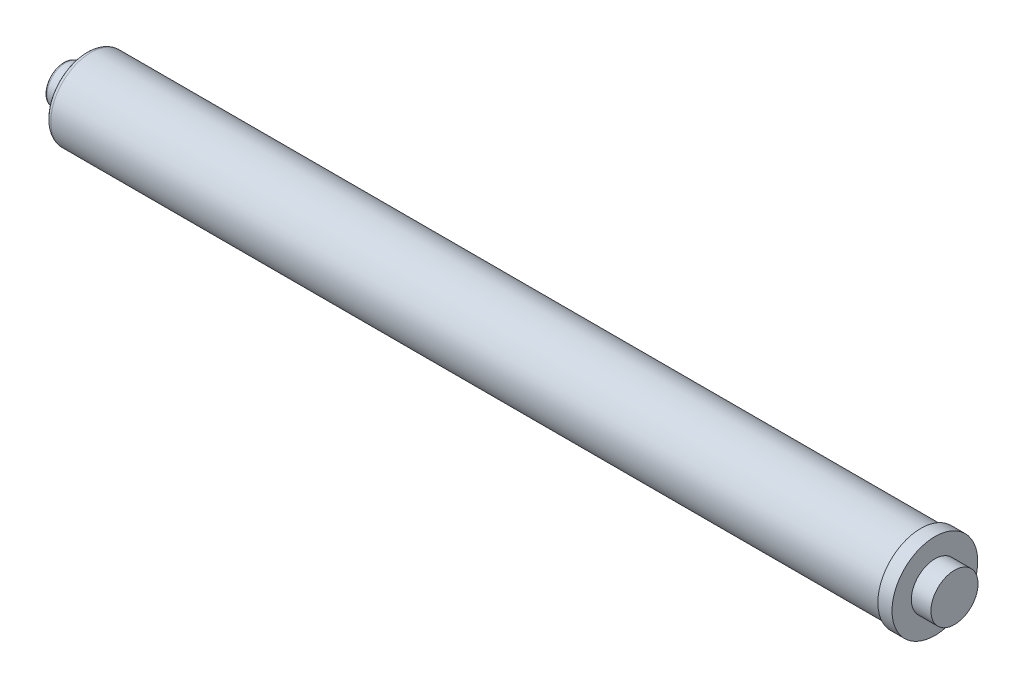
ISO-10303-21;
HEADER;
FILE_DESCRIPTION(('STEP AP214'),'2;1');
FILE_NAME('part.step','',(''),(''),'','','');
FILE_SCHEMA(('AUTOMOTIVE_DESIGN { 1 0 10303 214 1 1 1 1 }'));
ENDSEC;
DATA;
#1=APPLICATION_CONTEXT('core data for automotive mechanical design processes');
#2=APPLICATION_PROTOCOL_DEFINITION('international standard','automotive_design',2000,#1);
#3=PRODUCT_CONTEXT('',#1,'mechanical');
#4=PRODUCT('Part','Part','',(#3));
#5=PRODUCT_RELATED_PRODUCT_CATEGORY('part','',(#4));
#6=PRODUCT_DEFINITION_FORMATION('','',#4);
#7=PRODUCT_DEFINITION_CONTEXT('part definition',#1,'design');
#8=PRODUCT_DEFINITION('design','',#6,#7);
#9=PRODUCT_DEFINITION_SHAPE('','',#8);
#10=(LENGTH_UNIT() NAMED_UNIT(*) SI_UNIT(.MILLI.,.METRE.));
#11=(NAMED_UNIT(*) PLANE_ANGLE_UNIT() SI_UNIT($,.RADIAN.));
#12=(NAMED_UNIT(*) SI_UNIT($,.STERADIAN.) SOLID_ANGLE_UNIT());
#13=UNCERTAINTY_MEASURE_WITH_UNIT(LENGTH_MEASURE(1.E-05),#10,'distance_accuracy_value','');
#14=(GEOMETRIC_REPRESENTATION_CONTEXT(3) GLOBAL_UNCERTAINTY_ASSIGNED_CONTEXT((#13)) GLOBAL_UNIT_ASSIGNED_CONTEXT((#10,
#11,#12)) REPRESENTATION_CONTEXT('',''));
#15=CARTESIAN_POINT('',(0.,0.,0.));
#16=DIRECTION('',(0.,0.,1.));
#17=DIRECTION('',(1.,0.,0.));
#18=AXIS2_PLACEMENT_3D('',#15,#16,#17);
#19=CARTESIAN_POINT('',(-319.562207995829,0.,0.));
#20=DIRECTION('',(-1.,0.,0.));
#21=DIRECTION('',(0.,0.,1.));
#22=AXIS2_PLACEMENT_3D('',#19,#20,#21);
#23=CYLINDRICAL_SURFACE('',#22,26.9875);
#24=CARTESIAN_POINT('',(-278.003,0.,0.));
#25=DIRECTION('',(-1.,0.,0.));
#26=DIRECTION('',(0.,0.,1.));
#27=AXIS2_PLACEMENT_3D('',#24,#25,#26);
#28=CIRCLE('',#27,26.9875);
#29=CARTESIAN_POINT('',(-278.003,0.,26.9875));
#30=VERTEX_POINT('',#29);
#31=EDGE_CURVE('E10',#30,#30,#28,.T.);
#32=ORIENTED_EDGE('',*,*,#31,.F.);
#33=EDGE_LOOP('',(#32));
#34=FACE_BOUND('',#33,.T.);
#35=CARTESIAN_POINT('',(281.178,0.,0.));
#36=DIRECTION('',(-1.,0.,0.));
#37=DIRECTION('',(0.,0.,1.));
#38=AXIS2_PLACEMENT_3D('',#35,#36,#37);
#39=CIRCLE('',#38,26.9875);
#40=CARTESIAN_POINT('',(281.178,0.,26.9875));
#41=VERTEX_POINT('',#40);
#42=EDGE_CURVE('E69',#41,#41,#39,.T.);
#43=ORIENTED_EDGE('',*,*,#42,.T.);
#44=EDGE_LOOP('',(#43));
#45=FACE_BOUND('',#44,.T.);
#46=ADVANCED_FACE('F35',(#34,#45),#23,.T.);
#47=CARTESIAN_POINT('',(-278.003,0.,0.));
#48=DIRECTION('',(-1.,0.,0.));
#49=DIRECTION('',(0.,0.,1.));
#50=AXIS2_PLACEMENT_3D('',#47,#48,#49);
#51=TOROIDAL_SURFACE('',#50,23.8125,3.17499999999999);
#52=CARTESIAN_POINT('',(-281.178,0.,0.));
#53=DIRECTION('',(-1.,0.,0.));
#54=DIRECTION('',(0.,0.,1.));
#55=AXIS2_PLACEMENT_3D('',#52,#53,#54);
#56=CIRCLE('',#55,23.8124999999999);
#57=CARTESIAN_POINT('',(-281.178,0.,23.8124999999999));
#58=VERTEX_POINT('',#57);
#59=EDGE_CURVE('E41',#58,#58,#56,.T.);
#60=ORIENTED_EDGE('',*,*,#59,.F.);
#61=EDGE_LOOP('',(#60));
#62=FACE_BOUND('',#61,.T.);
#63=ORIENTED_EDGE('',*,*,#31,.T.);
#64=EDGE_LOOP('',(#63));
#65=FACE_BOUND('',#64,.T.);
#66=ADVANCED_FACE('F86',(#62,#65),#51,.T.);
#67=CARTESIAN_POINT('',(-281.178,0.,0.));
#68=DIRECTION('',(-1.,0.,0.));
#69=DIRECTION('',(0.,0.,1.));
#70=AXIS2_PLACEMENT_3D('',#67,#68,#69);
#71=PLANE('',#70);
#72=ORIENTED_EDGE('',*,*,#59,.T.);
#73=EDGE_LOOP('',(#72));
#74=FACE_BOUND('',#73,.T.);
#75=CARTESIAN_POINT('',(-281.178,0.,0.));
#76=DIRECTION('',(-1.,0.,0.));
#77=DIRECTION('',(0.,0.,1.));
#78=AXIS2_PLACEMENT_3D('',#75,#76,#77);
#79=CIRCLE('',#78,12.7);
#80=CARTESIAN_POINT('',(-281.178,0.,12.7));
#81=VERTEX_POINT('',#80);
#82=EDGE_CURVE('E45',#81,#81,#79,.T.);
#83=ORIENTED_EDGE('',*,*,#82,.F.);
#84=EDGE_LOOP('',(#83));
#85=FACE_BOUND('',#84,.T.);
#86=ADVANCED_FACE('F91',(#74,#85),#71,.T.);
#87=CARTESIAN_POINT('',(-319.562207995829,0.,0.));
#88=DIRECTION('',(-1.,0.,0.));
#89=DIRECTION('',(0.,0.,1.));
#90=AXIS2_PLACEMENT_3D('',#87,#88,#89);
#91=CYLINDRICAL_SURFACE('',#90,12.7);
#92=ORIENTED_EDGE('',*,*,#82,.T.);
#93=EDGE_LOOP('',(#92));
#94=FACE_BOUND('',#93,.T.);
#95=CARTESIAN_POINT('',(-294.8305,0.,0.));
#96=DIRECTION('',(-1.,0.,0.));
#97=DIRECTION('',(0.,0.,1.));
#98=AXIS2_PLACEMENT_3D('',#95,#96,#97);
#99=CIRCLE('',#98,12.7);
#100=CARTESIAN_POINT('',(-294.8305,0.,12.7));
#101=VERTEX_POINT('',#100);
#102=EDGE_CURVE('E49',#101,#101,#99,.T.);
#103=ORIENTED_EDGE('',*,*,#102,.F.);
#104=EDGE_LOOP('',(#103));
#105=FACE_BOUND('',#104,.T.);
#106=ADVANCED_FACE('F96',(#94,#105),#91,.T.);
#107=CARTESIAN_POINT('',(-294.8305,0.,0.));
#108=DIRECTION('',(-1.,0.,0.));
#109=DIRECTION('',(0.,0.,1.));
#110=AXIS2_PLACEMENT_3D('',#107,#108,#109);
#111=TOROIDAL_SURFACE('',#110,11.1125,1.58750000000001);
#112=ORIENTED_EDGE('',*,*,#102,.T.);
#113=EDGE_LOOP('',(#112));
#114=FACE_BOUND('',#113,.T.);
#115=CARTESIAN_POINT('',(-296.418,0.,0.));
#116=DIRECTION('',(-1.,0.,0.));
#117=DIRECTION('',(0.,0.,1.));
#118=AXIS2_PLACEMENT_3D('',#115,#116,#117);
#119=CIRCLE('',#118,11.1125);
#120=CARTESIAN_POINT('',(-296.418,0.,11.1125));
#121=VERTEX_POINT('',#120);
#122=EDGE_CURVE('E54',#121,#121,#119,.T.);
#123=ORIENTED_EDGE('',*,*,#122,.F.);
#124=EDGE_LOOP('',(#123));
#125=FACE_BOUND('',#124,.T.);
#126=ADVANCED_FACE('F101',(#114,#125),#111,.T.);
#127=CARTESIAN_POINT('',(-296.418,0.,0.));
#128=DIRECTION('',(-1.,0.,0.));
#129=DIRECTION('',(0.,0.,1.));
#130=AXIS2_PLACEMENT_3D('',#127,#128,#129);
#131=PLANE('',#130);
#132=ORIENTED_EDGE('',*,*,#122,.T.);
#133=EDGE_LOOP('',(#132));
#134=FACE_BOUND('',#133,.T.);
#135=ADVANCED_FACE('F105',(#134),#131,.T.);
#136=CARTESIAN_POINT('',(303.911,0.,0.));
#137=DIRECTION('',(-1.,0.,0.));
#138=DIRECTION('',(0.,0.,1.));
#139=AXIS2_PLACEMENT_3D('',#136,#137,#138);
#140=PLANE('',#139);
#141=CARTESIAN_POINT('',(303.911,0.,0.));
#142=DIRECTION('',(-1.,0.,0.));
#143=DIRECTION('',(0.,0.,1.));
#144=AXIS2_PLACEMENT_3D('',#141,#142,#143);
#145=CIRCLE('',#144,15.875);
#146=CARTESIAN_POINT('',(303.911,0.,15.875));
#147=VERTEX_POINT('',#146);
#148=EDGE_CURVE('E57',#147,#147,#145,.T.);
#149=ORIENTED_EDGE('',*,*,#148,.F.);
#150=EDGE_LOOP('',(#149));
#151=FACE_BOUND('',#150,.T.);
#152=ADVANCED_FACE('F109',(#151),#140,.F.);
#153=CARTESIAN_POINT('',(-319.562207995829,0.,0.));
#154=DIRECTION('',(-1.,0.,0.));
#155=DIRECTION('',(0.,0.,1.));
#156=AXIS2_PLACEMENT_3D('',#153,#154,#155);
#157=CYLINDRICAL_SURFACE('',#156,15.875);
#158=CARTESIAN_POINT('',(290.703,0.,0.));
#159=DIRECTION('',(-1.,0.,0.));
#160=DIRECTION('',(0.,0.,1.));
#161=AXIS2_PLACEMENT_3D('',#158,#159,#160);
#162=CIRCLE('',#161,15.875);
#163=CARTESIAN_POINT('',(290.703,0.,15.875));
#164=VERTEX_POINT('',#163);
#165=EDGE_CURVE('E60',#164,#164,#162,.T.);
#166=ORIENTED_EDGE('',*,*,#165,.F.);
#167=EDGE_LOOP('',(#166));
#168=FACE_BOUND('',#167,.T.);
#169=ORIENTED_EDGE('',*,*,#148,.T.);
#170=EDGE_LOOP('',(#169));
#171=FACE_BOUND('',#170,.T.);
#172=ADVANCED_FACE('F113',(#168,#171),#157,.T.);
#173=CARTESIAN_POINT('',(290.703,0.,2.79263791578789E-13));
#174=DIRECTION('',(-1.,0.,0.));
#175=DIRECTION('',(0.,0.,1.));
#176=AXIS2_PLACEMENT_3D('',#173,#174,#175);
#177=PLANE('',#176);
#178=CARTESIAN_POINT('',(290.703,0.,0.));
#179=DIRECTION('',(-1.,0.,0.));
#180=DIRECTION('',(0.,0.,1.));
#181=AXIS2_PLACEMENT_3D('',#178,#179,#180);
#182=CIRCLE('',#181,28.8925000000003);
#183=CARTESIAN_POINT('',(290.703,0.,28.8925000000003));
#184=VERTEX_POINT('',#183);
#185=EDGE_CURVE('E63',#184,#184,#182,.T.);
#186=ORIENTED_EDGE('',*,*,#185,.F.);
#187=EDGE_LOOP('',(#186));
#188=FACE_BOUND('',#187,.T.);
#189=ORIENTED_EDGE('',*,*,#165,.T.);
#190=EDGE_LOOP('',(#189));
#191=FACE_BOUND('',#190,.T.);
#192=ADVANCED_FACE('F82',(#188,#191),#177,.F.);
#193=CARTESIAN_POINT('',(-319.562207995829,0.,0.));
#194=DIRECTION('',(-1.,0.,0.));
#195=DIRECTION('',(0.,0.,1.));
#196=AXIS2_PLACEMENT_3D('',#193,#194,#195);
#197=CYLINDRICAL_SURFACE('',#196,28.8925000000003);
#198=CARTESIAN_POINT('',(281.178,0.,0.));
#199=DIRECTION('',(-1.,0.,0.));
#200=DIRECTION('',(0.,0.,1.));
#201=AXIS2_PLACEMENT_3D('',#198,#199,#200);
#202=CIRCLE('',#201,28.8925000000003);
#203=CARTESIAN_POINT('',(281.178,0.,28.8925000000003));
#204=VERTEX_POINT('',#203);
#205=EDGE_CURVE('E66',#204,#204,#202,.T.);
#206=ORIENTED_EDGE('',*,*,#205,.F.);
#207=EDGE_LOOP('',(#206));
#208=FACE_BOUND('',#207,.T.);
#209=ORIENTED_EDGE('',*,*,#185,.T.);
#210=EDGE_LOOP('',(#209));
#211=FACE_BOUND('',#210,.T.);
#212=ADVANCED_FACE('F76',(#208,#211),#197,.T.);
#213=CARTESIAN_POINT('',(281.178,0.,0.));
#214=DIRECTION('',(-1.,0.,0.));
#215=DIRECTION('',(0.,0.,1.));
#216=AXIS2_PLACEMENT_3D('',#213,#214,#215);
#217=PLANE('',#216);
#218=ORIENTED_EDGE('',*,*,#205,.T.);
#219=EDGE_LOOP('',(#218));
#220=FACE_BOUND('',#219,.T.);
#221=ORIENTED_EDGE('',*,*,#42,.F.);
#222=EDGE_LOOP('',(#221));
#223=FACE_BOUND('',#222,.T.);
#224=ADVANCED_FACE('F74',(#220,#223),#217,.T.);
#225=CLOSED_SHELL('',(#46,#66,#86,#106,#126,#135,#152,#172,#192,#212,#224));
#226=MANIFOLD_SOLID_BREP('B2',#225);
#227=ADVANCED_BREP_SHAPE_REPRESENTATION('',(#18,#226),#14);
#228=SHAPE_DEFINITION_REPRESENTATION(#9,#227);
ENDSEC;
END-ISO-10303-21;
